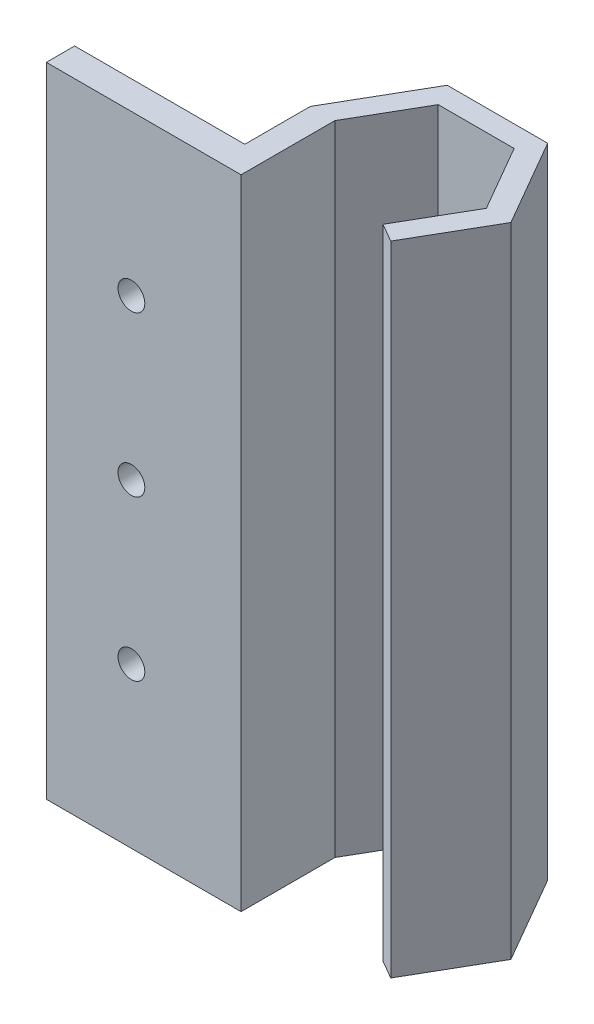
ISO-10303-21;
HEADER;
FILE_DESCRIPTION(('STEP AP214'),'2;1');
FILE_NAME('part.step','',(''),(''),'','','');
FILE_SCHEMA(('AUTOMOTIVE_DESIGN { 1 0 10303 214 1 1 1 1 }'));
ENDSEC;
DATA;
#1=APPLICATION_CONTEXT('core data for automotive mechanical design processes');
#2=APPLICATION_PROTOCOL_DEFINITION('international standard','automotive_design',2000,#1);
#3=PRODUCT_CONTEXT('',#1,'mechanical');
#4=PRODUCT('Part','Part','',(#3));
#5=PRODUCT_RELATED_PRODUCT_CATEGORY('part','',(#4));
#6=PRODUCT_DEFINITION_FORMATION('','',#4);
#7=PRODUCT_DEFINITION_CONTEXT('part definition',#1,'design');
#8=PRODUCT_DEFINITION('design','',#6,#7);
#9=PRODUCT_DEFINITION_SHAPE('','',#8);
#10=(LENGTH_UNIT() NAMED_UNIT(*) SI_UNIT(.MILLI.,.METRE.));
#11=(NAMED_UNIT(*) PLANE_ANGLE_UNIT() SI_UNIT($,.RADIAN.));
#12=(NAMED_UNIT(*) SI_UNIT($,.STERADIAN.) SOLID_ANGLE_UNIT());
#13=UNCERTAINTY_MEASURE_WITH_UNIT(LENGTH_MEASURE(1.E-05),#10,'distance_accuracy_value','');
#14=(GEOMETRIC_REPRESENTATION_CONTEXT(3) GLOBAL_UNCERTAINTY_ASSIGNED_CONTEXT((#13)) GLOBAL_UNIT_ASSIGNED_CONTEXT((#10,
#11,#12)) REPRESENTATION_CONTEXT('',''));
#15=CARTESIAN_POINT('',(0.,0.,0.));
#16=DIRECTION('',(0.,0.,1.));
#17=DIRECTION('',(1.,0.,0.));
#18=AXIS2_PLACEMENT_3D('',#15,#16,#17);
#19=CARTESIAN_POINT('',(-23.5847584963962,-150.,-0.05));
#20=DIRECTION('',(-1.,0.,0.));
#21=DIRECTION('',(0.,0.,1.));
#22=AXIS2_PLACEMENT_3D('',#19,#20,#21);
#23=PLANE('',#22);
#24=DIRECTION('',(0.,0.,1.));
#25=VECTOR('',#24,1.);
#26=CARTESIAN_POINT('',(-23.5847584963962,0.,-0.05));
#27=LINE('',#26,#25);
#28=CARTESIAN_POINT('',(-23.5847584963962,0.,-0.05));
#29=VERTEX_POINT('',#28);
#30=CARTESIAN_POINT('',(-23.5847584963962,0.,15.35));
#31=VERTEX_POINT('',#30);
#32=EDGE_CURVE('E180',#29,#31,#27,.T.);
#33=ORIENTED_EDGE('',*,*,#32,.F.);
#34=DIRECTION('',(0.,1.,0.));
#35=VECTOR('',#34,1.);
#36=CARTESIAN_POINT('',(-23.5847584963962,-150.,-0.05));
#37=LINE('',#36,#35);
#38=CARTESIAN_POINT('',(-23.5847584963962,-150.,-0.05));
#39=VERTEX_POINT('',#38);
#40=EDGE_CURVE('E11',#39,#29,#37,.T.);
#41=ORIENTED_EDGE('',*,*,#40,.F.);
#42=DIRECTION('',(0.,0.,1.));
#43=VECTOR('',#42,1.);
#44=CARTESIAN_POINT('',(-23.5847584963962,-150.,-0.05));
#45=LINE('',#44,#43);
#46=CARTESIAN_POINT('',(-23.5847584963962,-150.,15.35));
#47=VERTEX_POINT('',#46);
#48=EDGE_CURVE('E229',#39,#47,#45,.T.);
#49=ORIENTED_EDGE('',*,*,#48,.T.);
#50=DIRECTION('',(0.,1.,0.));
#51=VECTOR('',#50,1.);
#52=CARTESIAN_POINT('',(-23.5847584963962,-150.,15.35));
#53=LINE('',#52,#51);
#54=EDGE_CURVE('E44',#47,#31,#53,.T.);
#55=ORIENTED_EDGE('',*,*,#54,.T.);
#56=EDGE_LOOP('',(#33,#41,#49,#55));
#57=FACE_BOUND('',#56,.T.);
#58=ADVANCED_FACE('F41',(#57),#23,.T.);
#59=CARTESIAN_POINT('',(-11.8068130049278,-150.,-20.45));
#60=DIRECTION('',(-0.866025403784438,0.,-0.5));
#61=DIRECTION('',(-0.5,0.,0.866025403784439));
#62=AXIS2_PLACEMENT_3D('',#59,#60,#61);
#63=PLANE('',#62);
#64=DIRECTION('',(-0.5,0.,0.866025403784438));
#65=VECTOR('',#64,1.);
#66=CARTESIAN_POINT('',(-11.8068130049278,0.,-20.45));
#67=LINE('',#66,#65);
#68=CARTESIAN_POINT('',(-11.8068130049278,0.,-20.45));
#69=VERTEX_POINT('',#68);
#70=EDGE_CURVE('E226',#69,#29,#67,.T.);
#71=ORIENTED_EDGE('',*,*,#70,.F.);
#72=DIRECTION('',(0.,1.,0.));
#73=VECTOR('',#72,1.);
#74=CARTESIAN_POINT('',(-11.8068130049278,-150.,-20.45));
#75=LINE('',#74,#73);
#76=CARTESIAN_POINT('',(-11.8068130049278,-150.,-20.45));
#77=VERTEX_POINT('',#76);
#78=EDGE_CURVE('E51',#77,#69,#75,.T.);
#79=ORIENTED_EDGE('',*,*,#78,.F.);
#80=DIRECTION('',(-0.5,0.,0.866025403784438));
#81=VECTOR('',#80,1.);
#82=CARTESIAN_POINT('',(-11.8068130049278,-150.,-20.45));
#83=LINE('',#82,#81);
#84=EDGE_CURVE('E166',#77,#39,#83,.T.);
#85=ORIENTED_EDGE('',*,*,#84,.T.);
#86=ORIENTED_EDGE('',*,*,#40,.T.);
#87=EDGE_LOOP('',(#71,#79,#85,#86));
#88=FACE_BOUND('',#87,.T.);
#89=ADVANCED_FACE('F270',(#88),#63,.T.);
#90=CARTESIAN_POINT('',(11.8068130049279,-150.,-20.45));
#91=DIRECTION('',(0.,0.,-1.));
#92=DIRECTION('',(-1.,0.,0.));
#93=AXIS2_PLACEMENT_3D('',#90,#91,#92);
#94=PLANE('',#93);
#95=DIRECTION('',(-1.,0.,0.));
#96=VECTOR('',#95,1.);
#97=CARTESIAN_POINT('',(11.8068130049279,0.,-20.45));
#98=LINE('',#97,#96);
#99=CARTESIAN_POINT('',(11.8068130049279,0.,-20.45));
#100=VERTEX_POINT('',#99);
#101=EDGE_CURVE('E152',#100,#69,#98,.T.);
#102=ORIENTED_EDGE('',*,*,#101,.F.);
#103=DIRECTION('',(0.,1.,0.));
#104=VECTOR('',#103,1.);
#105=CARTESIAN_POINT('',(11.8068130049279,-150.,-20.45));
#106=LINE('',#105,#104);
#107=CARTESIAN_POINT('',(11.8068130049279,-150.,-20.45));
#108=VERTEX_POINT('',#107);
#109=EDGE_CURVE('E147',#108,#100,#106,.T.);
#110=ORIENTED_EDGE('',*,*,#109,.F.);
#111=DIRECTION('',(-1.,0.,0.));
#112=VECTOR('',#111,1.);
#113=CARTESIAN_POINT('',(11.8068130049279,-150.,-20.45));
#114=LINE('',#113,#112);
#115=EDGE_CURVE('E150',#108,#77,#114,.T.);
#116=ORIENTED_EDGE('',*,*,#115,.T.);
#117=ORIENTED_EDGE('',*,*,#78,.T.);
#118=EDGE_LOOP('',(#102,#110,#116,#117));
#119=FACE_BOUND('',#118,.T.);
#120=ADVANCED_FACE('F149',(#119),#94,.T.);
#121=CARTESIAN_POINT('',(23.6136260098557,-150.,0.));
#122=DIRECTION('',(0.866025403784439,0.,-0.5));
#123=DIRECTION('',(-0.5,0.,-0.866025403784439));
#124=AXIS2_PLACEMENT_3D('',#121,#122,#123);
#125=PLANE('',#124);
#126=DIRECTION('',(-0.5,0.,-0.866025403784439));
#127=VECTOR('',#126,1.);
#128=CARTESIAN_POINT('',(23.6136260098557,0.,0.));
#129=LINE('',#128,#127);
#130=CARTESIAN_POINT('',(23.6136260098557,0.,0.));
#131=VERTEX_POINT('',#130);
#132=EDGE_CURVE('E221',#131,#100,#129,.T.);
#133=ORIENTED_EDGE('',*,*,#132,.F.);
#134=DIRECTION('',(0.,1.,0.));
#135=VECTOR('',#134,1.);
#136=CARTESIAN_POINT('',(23.6136260098557,-150.,0.));
#137=LINE('',#136,#135);
#138=CARTESIAN_POINT('',(23.6136260098557,-150.,0.));
#139=VERTEX_POINT('',#138);
#140=EDGE_CURVE('E158',#139,#131,#137,.T.);
#141=ORIENTED_EDGE('',*,*,#140,.F.);
#142=DIRECTION('',(-0.5,0.,-0.866025403784439));
#143=VECTOR('',#142,1.);
#144=CARTESIAN_POINT('',(23.6136260098557,-150.,0.));
#145=LINE('',#144,#143);
#146=EDGE_CURVE('E164',#139,#108,#145,.T.);
#147=ORIENTED_EDGE('',*,*,#146,.T.);
#148=ORIENTED_EDGE('',*,*,#109,.T.);
#149=EDGE_LOOP('',(#133,#141,#147,#148));
#150=FACE_BOUND('',#149,.T.);
#151=ADVANCED_FACE('F169',(#150),#125,.T.);
#152=CARTESIAN_POINT('',(13.2790561913614,-150.,17.9));
#153=DIRECTION('',(0.866025403784439,0.,0.5));
#154=DIRECTION('',(0.5,0.,-0.866025403784439));
#155=AXIS2_PLACEMENT_3D('',#152,#153,#154);
#156=PLANE('',#155);
#157=DIRECTION('',(0.5,0.,-0.866025403784439));
#158=VECTOR('',#157,1.);
#159=CARTESIAN_POINT('',(13.2790561913614,0.,17.9));
#160=LINE('',#159,#158);
#161=CARTESIAN_POINT('',(13.2790561913614,0.,17.9));
#162=VERTEX_POINT('',#161);
#163=EDGE_CURVE('E217',#162,#131,#160,.T.);
#164=ORIENTED_EDGE('',*,*,#163,.F.);
#165=DIRECTION('',(0.,1.,0.));
#166=VECTOR('',#165,1.);
#167=CARTESIAN_POINT('',(13.2790561913614,-150.,17.9));
#168=LINE('',#167,#166);
#169=CARTESIAN_POINT('',(13.2790561913614,-150.,17.9));
#170=VERTEX_POINT('',#169);
#171=EDGE_CURVE('E235',#170,#162,#168,.T.);
#172=ORIENTED_EDGE('',*,*,#171,.F.);
#173=DIRECTION('',(0.5,0.,-0.866025403784439));
#174=VECTOR('',#173,1.);
#175=CARTESIAN_POINT('',(13.2790561913614,-150.,17.9));
#176=LINE('',#175,#174);
#177=EDGE_CURVE('E171',#170,#139,#176,.T.);
#178=ORIENTED_EDGE('',*,*,#177,.T.);
#179=ORIENTED_EDGE('',*,*,#140,.T.);
#180=EDGE_LOOP('',(#164,#172,#178,#179));
#181=FACE_BOUND('',#180,.T.);
#182=ADVANCED_FACE('F283',(#181),#156,.T.);
#183=CARTESIAN_POINT('',(8.9489291724392,-150.,15.4));
#184=DIRECTION('',(-0.5,0.,0.866025403784439));
#185=DIRECTION('',(0.866025403784439,0.,0.5));
#186=AXIS2_PLACEMENT_3D('',#183,#184,#185);
#187=PLANE('',#186);
#188=DIRECTION('',(0.866025403784439,0.,0.5));
#189=VECTOR('',#188,1.);
#190=CARTESIAN_POINT('',(8.9489291724392,0.,15.4));
#191=LINE('',#190,#189);
#192=CARTESIAN_POINT('',(8.9489291724392,0.,15.4));
#193=VERTEX_POINT('',#192);
#194=EDGE_CURVE('E213',#193,#162,#191,.T.);
#195=ORIENTED_EDGE('',*,*,#194,.F.);
#196=DIRECTION('',(0.,1.,0.));
#197=VECTOR('',#196,1.);
#198=CARTESIAN_POINT('',(8.9489291724392,-150.,15.4));
#199=LINE('',#198,#197);
#200=CARTESIAN_POINT('',(8.9489291724392,-150.,15.4));
#201=VERTEX_POINT('',#200);
#202=EDGE_CURVE('E238',#201,#193,#199,.T.);
#203=ORIENTED_EDGE('',*,*,#202,.F.);
#204=DIRECTION('',(0.866025403784439,0.,0.5));
#205=VECTOR('',#204,1.);
#206=CARTESIAN_POINT('',(8.9489291724392,-150.,15.4));
#207=LINE('',#206,#205);
#208=EDGE_CURVE('E174',#201,#170,#207,.T.);
#209=ORIENTED_EDGE('',*,*,#208,.T.);
#210=ORIENTED_EDGE('',*,*,#171,.T.);
#211=EDGE_LOOP('',(#195,#203,#209,#210));
#212=FACE_BOUND('',#211,.T.);
#213=ADVANCED_FACE('F286',(#212),#187,.T.);
#214=CARTESIAN_POINT('',(8.9489291724392,-150.,15.4));
#215=DIRECTION('',(0.866025403784438,0.,0.5));
#216=DIRECTION('',(0.5,0.,-0.866025403784439));
#217=AXIS2_PLACEMENT_3D('',#214,#215,#216);
#218=PLANE('',#217);
#219=DIRECTION('',(0.5,0.,-0.866025403784438));
#220=VECTOR('',#219,1.);
#221=CARTESIAN_POINT('',(8.9489291724392,0.,15.4));
#222=LINE('',#221,#220);
#223=CARTESIAN_POINT('',(17.8401233179594,0.,0.));
#224=VERTEX_POINT('',#223);
#225=EDGE_CURVE('E210',#193,#224,#222,.T.);
#226=ORIENTED_EDGE('',*,*,#225,.T.);
#227=DIRECTION('',(0.,1.,0.));
#228=VECTOR('',#227,1.);
#229=CARTESIAN_POINT('',(17.8401233179594,-150.,0.));
#230=LINE('',#229,#228);
#231=CARTESIAN_POINT('',(17.8401233179594,-150.,0.));
#232=VERTEX_POINT('',#231);
#233=EDGE_CURVE('E241',#232,#224,#230,.T.);
#234=ORIENTED_EDGE('',*,*,#233,.F.);
#235=DIRECTION('',(0.5,0.,-0.866025403784438));
#236=VECTOR('',#235,1.);
#237=CARTESIAN_POINT('',(8.9489291724392,-150.,15.4));
#238=LINE('',#237,#236);
#239=EDGE_CURVE('E376',#201,#232,#238,.T.);
#240=ORIENTED_EDGE('',*,*,#239,.F.);
#241=ORIENTED_EDGE('',*,*,#202,.T.);
#242=EDGE_LOOP('',(#226,#234,#240,#241));
#243=FACE_BOUND('',#242,.T.);
#244=ADVANCED_FACE('F290',(#243),#218,.F.);
#245=CARTESIAN_POINT('',(17.8401233179594,-150.,0.));
#246=DIRECTION('',(0.866025403784438,0.,-0.5));
#247=DIRECTION('',(-0.5,0.,-0.866025403784439));
#248=AXIS2_PLACEMENT_3D('',#245,#246,#247);
#249=PLANE('',#248);
#250=DIRECTION('',(-0.5,0.,-0.866025403784438));
#251=VECTOR('',#250,1.);
#252=CARTESIAN_POINT('',(17.8401233179594,0.,0.));
#253=LINE('',#252,#251);
#254=CARTESIAN_POINT('',(8.92006165897971,0.,-15.45));
#255=VERTEX_POINT('',#254);
#256=EDGE_CURVE('E207',#224,#255,#253,.T.);
#257=ORIENTED_EDGE('',*,*,#256,.T.);
#258=DIRECTION('',(0.,1.,0.));
#259=VECTOR('',#258,1.);
#260=CARTESIAN_POINT('',(8.92006165897971,-150.,-15.45));
#261=LINE('',#260,#259);
#262=CARTESIAN_POINT('',(8.92006165897971,-150.,-15.45));
#263=VERTEX_POINT('',#262);
#264=EDGE_CURVE('E245',#263,#255,#261,.T.);
#265=ORIENTED_EDGE('',*,*,#264,.F.);
#266=DIRECTION('',(-0.5,0.,-0.866025403784438));
#267=VECTOR('',#266,1.);
#268=CARTESIAN_POINT('',(17.8401233179594,-150.,0.));
#269=LINE('',#268,#267);
#270=EDGE_CURVE('E373',#232,#263,#269,.T.);
#271=ORIENTED_EDGE('',*,*,#270,.F.);
#272=ORIENTED_EDGE('',*,*,#233,.T.);
#273=EDGE_LOOP('',(#257,#265,#271,#272));
#274=FACE_BOUND('',#273,.T.);
#275=ADVANCED_FACE('F294',(#274),#249,.F.);
#276=CARTESIAN_POINT('',(8.92006165897971,-150.,-15.45));
#277=DIRECTION('',(0.,0.,-1.));
#278=DIRECTION('',(-1.,0.,0.));
#279=AXIS2_PLACEMENT_3D('',#276,#277,#278);
#280=PLANE('',#279);
#281=DIRECTION('',(-1.,0.,0.));
#282=VECTOR('',#281,1.);
#283=CARTESIAN_POINT('',(8.92006165897971,0.,-15.45));
#284=LINE('',#283,#282);
#285=CARTESIAN_POINT('',(-8.92006165897972,0.,-15.45));
#286=VERTEX_POINT('',#285);
#287=EDGE_CURVE('E204',#255,#286,#284,.T.);
#288=ORIENTED_EDGE('',*,*,#287,.T.);
#289=DIRECTION('',(0.,1.,0.));
#290=VECTOR('',#289,1.);
#291=CARTESIAN_POINT('',(-8.92006165897972,-150.,-15.45));
#292=LINE('',#291,#290);
#293=CARTESIAN_POINT('',(-8.92006165897972,-150.,-15.45));
#294=VERTEX_POINT('',#293);
#295=EDGE_CURVE('E249',#294,#286,#292,.T.);
#296=ORIENTED_EDGE('',*,*,#295,.F.);
#297=DIRECTION('',(-1.,0.,0.));
#298=VECTOR('',#297,1.);
#299=CARTESIAN_POINT('',(8.92006165897971,-150.,-15.45));
#300=LINE('',#299,#298);
#301=EDGE_CURVE('E370',#263,#294,#300,.T.);
#302=ORIENTED_EDGE('',*,*,#301,.F.);
#303=ORIENTED_EDGE('',*,*,#264,.T.);
#304=EDGE_LOOP('',(#288,#296,#302,#303));
#305=FACE_BOUND('',#304,.T.);
#306=ADVANCED_FACE('F298',(#305),#280,.F.);
#307=CARTESIAN_POINT('',(-8.92006165897972,-150.,-15.45));
#308=DIRECTION('',(-0.866025403784439,0.,-0.5));
#309=DIRECTION('',(-0.5,0.,0.866025403784439));
#310=AXIS2_PLACEMENT_3D('',#307,#308,#309);
#311=PLANE('',#310);
#312=DIRECTION('',(-0.5,0.,0.866025403784439));
#313=VECTOR('',#312,1.);
#314=CARTESIAN_POINT('',(-8.92006165897972,0.,-15.45));
#315=LINE('',#314,#313);
#316=CARTESIAN_POINT('',(-17.8112558045,0.,-0.05));
#317=VERTEX_POINT('',#316);
#318=EDGE_CURVE('E201',#286,#317,#315,.T.);
#319=ORIENTED_EDGE('',*,*,#318,.T.);
#320=DIRECTION('',(0.,1.,0.));
#321=VECTOR('',#320,1.);
#322=CARTESIAN_POINT('',(-17.8112558045,-150.,-0.05));
#323=LINE('',#322,#321);
#324=CARTESIAN_POINT('',(-17.8112558045,-150.,-0.05));
#325=VERTEX_POINT('',#324);
#326=EDGE_CURVE('E253',#325,#317,#323,.T.);
#327=ORIENTED_EDGE('',*,*,#326,.F.);
#328=DIRECTION('',(-0.5,0.,0.866025403784439));
#329=VECTOR('',#328,1.);
#330=CARTESIAN_POINT('',(-8.92006165897972,-150.,-15.45));
#331=LINE('',#330,#329);
#332=EDGE_CURVE('E367',#294,#325,#331,.T.);
#333=ORIENTED_EDGE('',*,*,#332,.F.);
#334=ORIENTED_EDGE('',*,*,#295,.T.);
#335=EDGE_LOOP('',(#319,#327,#333,#334));
#336=FACE_BOUND('',#335,.T.);
#337=ADVANCED_FACE('F302',(#336),#311,.F.);
#338=CARTESIAN_POINT('',(-17.8112558045,-150.,-0.05));
#339=DIRECTION('',(-1.,0.,0.));
#340=DIRECTION('',(0.,0.,1.));
#341=AXIS2_PLACEMENT_3D('',#338,#339,#340);
#342=PLANE('',#341);
#343=DIRECTION('',(0.,0.,1.));
#344=VECTOR('',#343,1.);
#345=CARTESIAN_POINT('',(-17.8112558045,0.,-0.05));
#346=LINE('',#345,#344);
#347=CARTESIAN_POINT('',(-17.8112558044999,0.,22.));
#348=VERTEX_POINT('',#347);
#349=EDGE_CURVE('E197',#317,#348,#346,.T.);
#350=ORIENTED_EDGE('',*,*,#349,.T.);
#351=DIRECTION('',(0.,1.,0.));
#352=VECTOR('',#351,1.);
#353=CARTESIAN_POINT('',(-17.8112558044999,-150.,22.));
#354=LINE('',#353,#352);
#355=CARTESIAN_POINT('',(-17.8112558044999,-150.,22.));
#356=VERTEX_POINT('',#355);
#357=EDGE_CURVE('E257',#356,#348,#354,.T.);
#358=ORIENTED_EDGE('',*,*,#357,.F.);
#359=DIRECTION('',(0.,0.,1.));
#360=VECTOR('',#359,1.);
#361=CARTESIAN_POINT('',(-17.8112558045,-150.,-0.05));
#362=LINE('',#361,#360);
#363=EDGE_CURVE('E364',#325,#356,#362,.T.);
#364=ORIENTED_EDGE('',*,*,#363,.F.);
#365=ORIENTED_EDGE('',*,*,#326,.T.);
#366=EDGE_LOOP('',(#350,#358,#364,#365));
#367=FACE_BOUND('',#366,.T.);
#368=ADVANCED_FACE('F306',(#367),#342,.F.);
#369=CARTESIAN_POINT('',(-63.5847584963962,-150.,22.));
#370=DIRECTION('',(0.,0.,1.));
#371=DIRECTION('',(1.,0.,0.));
#372=AXIS2_PLACEMENT_3D('',#369,#370,#371);
#373=PLANE('',#372);
#374=CARTESIAN_POINT('',(-43.5847584963962,-37.5,22.));
#375=DIRECTION('',(0.,0.,1.));
#376=DIRECTION('',(1.,0.,0.));
#377=AXIS2_PLACEMENT_3D('',#374,#375,#376);
#378=CIRCLE('',#377,3.15);
#379=CARTESIAN_POINT('',(-40.4347584963962,-37.5,22.));
#380=VERTEX_POINT('',#379);
#381=EDGE_CURVE('E185',#380,#380,#378,.T.);
#382=ORIENTED_EDGE('',*,*,#381,.F.);
#383=EDGE_LOOP('',(#382));
#384=FACE_BOUND('',#383,.T.);
#385=CARTESIAN_POINT('',(-43.5847584963962,-75.,22.));
#386=DIRECTION('',(0.,0.,1.));
#387=DIRECTION('',(1.,0.,0.));
#388=AXIS2_PLACEMENT_3D('',#385,#386,#387);
#389=CIRCLE('',#388,3.15);
#390=CARTESIAN_POINT('',(-40.4347584963962,-75.,22.));
#391=VERTEX_POINT('',#390);
#392=EDGE_CURVE('E345',#391,#391,#389,.T.);
#393=ORIENTED_EDGE('',*,*,#392,.F.);
#394=EDGE_LOOP('',(#393));
#395=FACE_BOUND('',#394,.T.);
#396=CARTESIAN_POINT('',(-43.5847584963962,-112.5,22.));
#397=DIRECTION('',(0.,0.,1.));
#398=DIRECTION('',(1.,0.,0.));
#399=AXIS2_PLACEMENT_3D('',#396,#397,#398);
#400=CIRCLE('',#399,3.15);
#401=CARTESIAN_POINT('',(-40.4347584963962,-112.5,22.));
#402=VERTEX_POINT('',#401);
#403=EDGE_CURVE('E341',#402,#402,#400,.T.);
#404=ORIENTED_EDGE('',*,*,#403,.F.);
#405=EDGE_LOOP('',(#404));
#406=FACE_BOUND('',#405,.T.);
#407=DIRECTION('',(1.,0.,0.));
#408=VECTOR('',#407,1.);
#409=CARTESIAN_POINT('',(-63.5847584963962,0.,22.));
#410=LINE('',#409,#408);
#411=CARTESIAN_POINT('',(-63.5847584963962,0.,22.));
#412=VERTEX_POINT('',#411);
#413=EDGE_CURVE('E193',#412,#348,#410,.T.);
#414=ORIENTED_EDGE('',*,*,#413,.F.);
#415=DIRECTION('',(0.,1.,0.));
#416=VECTOR('',#415,1.);
#417=CARTESIAN_POINT('',(-63.5847584963962,-150.,22.));
#418=LINE('',#417,#416);
#419=CARTESIAN_POINT('',(-63.5847584963962,-150.,22.));
#420=VERTEX_POINT('',#419);
#421=EDGE_CURVE('E260',#420,#412,#418,.T.);
#422=ORIENTED_EDGE('',*,*,#421,.F.);
#423=DIRECTION('',(1.,0.,0.));
#424=VECTOR('',#423,1.);
#425=CARTESIAN_POINT('',(-63.5847584963962,-150.,22.));
#426=LINE('',#425,#424);
#427=EDGE_CURVE('E360',#420,#356,#426,.T.);
#428=ORIENTED_EDGE('',*,*,#427,.T.);
#429=ORIENTED_EDGE('',*,*,#357,.T.);
#430=EDGE_LOOP('',(#414,#422,#428,#429));
#431=FACE_BOUND('',#430,.T.);
#432=ADVANCED_FACE('F310',(#384,#395,#406,#431),#373,.T.);
#433=CARTESIAN_POINT('',(-63.5847584963962,-150.,22.));
#434=DIRECTION('',(1.,0.,0.));
#435=DIRECTION('',(0.,0.,-1.));
#436=AXIS2_PLACEMENT_3D('',#433,#434,#435);
#437=PLANE('',#436);
#438=DIRECTION('',(0.,0.,-1.));
#439=VECTOR('',#438,1.);
#440=CARTESIAN_POINT('',(-63.5847584963962,0.,22.));
#441=LINE('',#440,#439);
#442=CARTESIAN_POINT('',(-63.5847584963962,0.,15.35));
#443=VERTEX_POINT('',#442);
#444=EDGE_CURVE('E189',#412,#443,#441,.T.);
#445=ORIENTED_EDGE('',*,*,#444,.T.);
#446=DIRECTION('',(0.,1.,0.));
#447=VECTOR('',#446,1.);
#448=CARTESIAN_POINT('',(-63.5847584963962,-150.,15.35));
#449=LINE('',#448,#447);
#450=CARTESIAN_POINT('',(-63.5847584963962,-150.,15.35));
#451=VERTEX_POINT('',#450);
#452=EDGE_CURVE('E262',#451,#443,#449,.T.);
#453=ORIENTED_EDGE('',*,*,#452,.F.);
#454=DIRECTION('',(0.,0.,-1.));
#455=VECTOR('',#454,1.);
#456=CARTESIAN_POINT('',(-63.5847584963962,-150.,22.));
#457=LINE('',#456,#455);
#458=EDGE_CURVE('E357',#420,#451,#457,.T.);
#459=ORIENTED_EDGE('',*,*,#458,.F.);
#460=ORIENTED_EDGE('',*,*,#421,.T.);
#461=EDGE_LOOP('',(#445,#453,#459,#460));
#462=FACE_BOUND('',#461,.T.);
#463=ADVANCED_FACE('F314',(#462),#437,.F.);
#464=CARTESIAN_POINT('',(-23.5847584963962,-150.,15.35));
#465=DIRECTION('',(0.,0.,-1.));
#466=DIRECTION('',(-1.,0.,0.));
#467=AXIS2_PLACEMENT_3D('',#464,#465,#466);
#468=PLANE('',#467);
#469=CARTESIAN_POINT('',(-43.5847584963962,-37.5,15.35));
#470=DIRECTION('',(0.,0.,-1.));
#471=DIRECTION('',(-1.,0.,0.));
#472=AXIS2_PLACEMENT_3D('',#469,#470,#471);
#473=CIRCLE('',#472,3.15);
#474=CARTESIAN_POINT('',(-46.7347584963962,-37.5,15.35));
#475=VERTEX_POINT('',#474);
#476=EDGE_CURVE('E326',#475,#475,#473,.T.);
#477=ORIENTED_EDGE('',*,*,#476,.F.);
#478=EDGE_LOOP('',(#477));
#479=FACE_BOUND('',#478,.T.);
#480=CARTESIAN_POINT('',(-43.5847584963962,-75.,15.35));
#481=DIRECTION('',(0.,0.,-1.));
#482=DIRECTION('',(-1.,0.,0.));
#483=AXIS2_PLACEMENT_3D('',#480,#481,#482);
#484=CIRCLE('',#483,3.15);
#485=CARTESIAN_POINT('',(-46.7347584963962,-75.,15.35));
#486=VERTEX_POINT('',#485);
#487=EDGE_CURVE('E330',#486,#486,#484,.T.);
#488=ORIENTED_EDGE('',*,*,#487,.F.);
#489=EDGE_LOOP('',(#488));
#490=FACE_BOUND('',#489,.T.);
#491=CARTESIAN_POINT('',(-43.5847584963962,-112.5,15.35));
#492=DIRECTION('',(0.,0.,-1.));
#493=DIRECTION('',(-1.,0.,0.));
#494=AXIS2_PLACEMENT_3D('',#491,#492,#493);
#495=CIRCLE('',#494,3.15);
#496=CARTESIAN_POINT('',(-46.7347584963962,-112.5,15.35));
#497=VERTEX_POINT('',#496);
#498=EDGE_CURVE('E333',#497,#497,#495,.T.);
#499=ORIENTED_EDGE('',*,*,#498,.F.);
#500=EDGE_LOOP('',(#499));
#501=FACE_BOUND('',#500,.T.);
#502=DIRECTION('',(-1.,0.,0.));
#503=VECTOR('',#502,1.);
#504=CARTESIAN_POINT('',(-23.5847584963962,0.,15.35));
#505=LINE('',#504,#503);
#506=EDGE_CURVE('E184',#31,#443,#505,.T.);
#507=ORIENTED_EDGE('',*,*,#506,.F.);
#508=ORIENTED_EDGE('',*,*,#54,.F.);
#509=DIRECTION('',(-1.,0.,0.));
#510=VECTOR('',#509,1.);
#511=CARTESIAN_POINT('',(-23.5847584963962,-150.,15.35));
#512=LINE('',#511,#510);
#513=EDGE_CURVE('E354',#47,#451,#512,.T.);
#514=ORIENTED_EDGE('',*,*,#513,.T.);
#515=ORIENTED_EDGE('',*,*,#452,.T.);
#516=EDGE_LOOP('',(#507,#508,#514,#515));
#517=FACE_BOUND('',#516,.T.);
#518=ADVANCED_FACE('F266',(#479,#490,#501,#517),#468,.T.);
#519=CARTESIAN_POINT('',(0.,-150.,0.));
#520=DIRECTION('',(0.,-1.,0.));
#521=DIRECTION('',(0.,0.,-1.));
#522=AXIS2_PLACEMENT_3D('',#519,#520,#521);
#523=PLANE('',#522);
#524=ORIENTED_EDGE('',*,*,#48,.F.);
#525=ORIENTED_EDGE('',*,*,#84,.F.);
#526=ORIENTED_EDGE('',*,*,#115,.F.);
#527=ORIENTED_EDGE('',*,*,#146,.F.);
#528=ORIENTED_EDGE('',*,*,#177,.F.);
#529=ORIENTED_EDGE('',*,*,#208,.F.);
#530=ORIENTED_EDGE('',*,*,#239,.T.);
#531=ORIENTED_EDGE('',*,*,#270,.T.);
#532=ORIENTED_EDGE('',*,*,#301,.T.);
#533=ORIENTED_EDGE('',*,*,#332,.T.);
#534=ORIENTED_EDGE('',*,*,#363,.T.);
#535=ORIENTED_EDGE('',*,*,#427,.F.);
#536=ORIENTED_EDGE('',*,*,#458,.T.);
#537=ORIENTED_EDGE('',*,*,#513,.F.);
#538=EDGE_LOOP('',(#524,#525,#526,#527,#528,#529,#530,#531,#532,#533,#534,#535,#536,#537));
#539=FACE_BOUND('',#538,.T.);
#540=ADVANCED_FACE('F162',(#539),#523,.T.);
#541=CARTESIAN_POINT('',(0.,0.,0.));
#542=DIRECTION('',(0.,-1.,0.));
#543=DIRECTION('',(0.,0.,-1.));
#544=AXIS2_PLACEMENT_3D('',#541,#542,#543);
#545=PLANE('',#544);
#546=ORIENTED_EDGE('',*,*,#32,.T.);
#547=ORIENTED_EDGE('',*,*,#506,.T.);
#548=ORIENTED_EDGE('',*,*,#444,.F.);
#549=ORIENTED_EDGE('',*,*,#413,.T.);
#550=ORIENTED_EDGE('',*,*,#349,.F.);
#551=ORIENTED_EDGE('',*,*,#318,.F.);
#552=ORIENTED_EDGE('',*,*,#287,.F.);
#553=ORIENTED_EDGE('',*,*,#256,.F.);
#554=ORIENTED_EDGE('',*,*,#225,.F.);
#555=ORIENTED_EDGE('',*,*,#194,.T.);
#556=ORIENTED_EDGE('',*,*,#163,.T.);
#557=ORIENTED_EDGE('',*,*,#132,.T.);
#558=ORIENTED_EDGE('',*,*,#101,.T.);
#559=ORIENTED_EDGE('',*,*,#70,.T.);
#560=EDGE_LOOP('',(#546,#547,#548,#549,#550,#551,#552,#553,#554,#555,#556,#557,#558,#559));
#561=FACE_BOUND('',#560,.T.);
#562=ADVANCED_FACE('F269',(#561),#545,.F.);
#563=CARTESIAN_POINT('',(-43.5847584963962,-112.5,25.35));
#564=DIRECTION('',(0.,0.,-1.));
#565=DIRECTION('',(-1.,0.,0.));
#566=AXIS2_PLACEMENT_3D('',#563,#564,#565);
#567=CYLINDRICAL_SURFACE('',#566,3.15);
#568=ORIENTED_EDGE('',*,*,#403,.T.);
#569=EDGE_LOOP('',(#568));
#570=FACE_BOUND('',#569,.T.);
#571=ORIENTED_EDGE('',*,*,#498,.T.);
#572=EDGE_LOOP('',(#571));
#573=FACE_BOUND('',#572,.T.);
#574=ADVANCED_FACE('F412',(#570,#573),#567,.F.);
#575=CARTESIAN_POINT('',(-43.5847584963962,-75.,25.35));
#576=DIRECTION('',(0.,0.,-1.));
#577=DIRECTION('',(-1.,0.,0.));
#578=AXIS2_PLACEMENT_3D('',#575,#576,#577);
#579=CYLINDRICAL_SURFACE('',#578,3.15);
#580=ORIENTED_EDGE('',*,*,#392,.T.);
#581=EDGE_LOOP('',(#580));
#582=FACE_BOUND('',#581,.T.);
#583=ORIENTED_EDGE('',*,*,#487,.T.);
#584=EDGE_LOOP('',(#583));
#585=FACE_BOUND('',#584,.T.);
#586=ADVANCED_FACE('F406',(#582,#585),#579,.F.);
#587=CARTESIAN_POINT('',(-43.5847584963962,-37.5,25.35));
#588=DIRECTION('',(0.,0.,-1.));
#589=DIRECTION('',(-1.,0.,0.));
#590=AXIS2_PLACEMENT_3D('',#587,#588,#589);
#591=CYLINDRICAL_SURFACE('',#590,3.15);
#592=ORIENTED_EDGE('',*,*,#381,.T.);
#593=EDGE_LOOP('',(#592));
#594=FACE_BOUND('',#593,.T.);
#595=ORIENTED_EDGE('',*,*,#476,.T.);
#596=EDGE_LOOP('',(#595));
#597=FACE_BOUND('',#596,.T.);
#598=ADVANCED_FACE('F404',(#594,#597),#591,.F.);
#599=CLOSED_SHELL('',(#58,#89,#120,#151,#182,#213,#244,#275,#306,#337,#368,#432,#463,#518,#540,
#562,#574,#586,#598));
#600=MANIFOLD_SOLID_BREP('B2',#599);
#601=ADVANCED_BREP_SHAPE_REPRESENTATION('',(#18,#600),#14);
#602=SHAPE_DEFINITION_REPRESENTATION(#9,#601);
ENDSEC;
END-ISO-10303-21;
